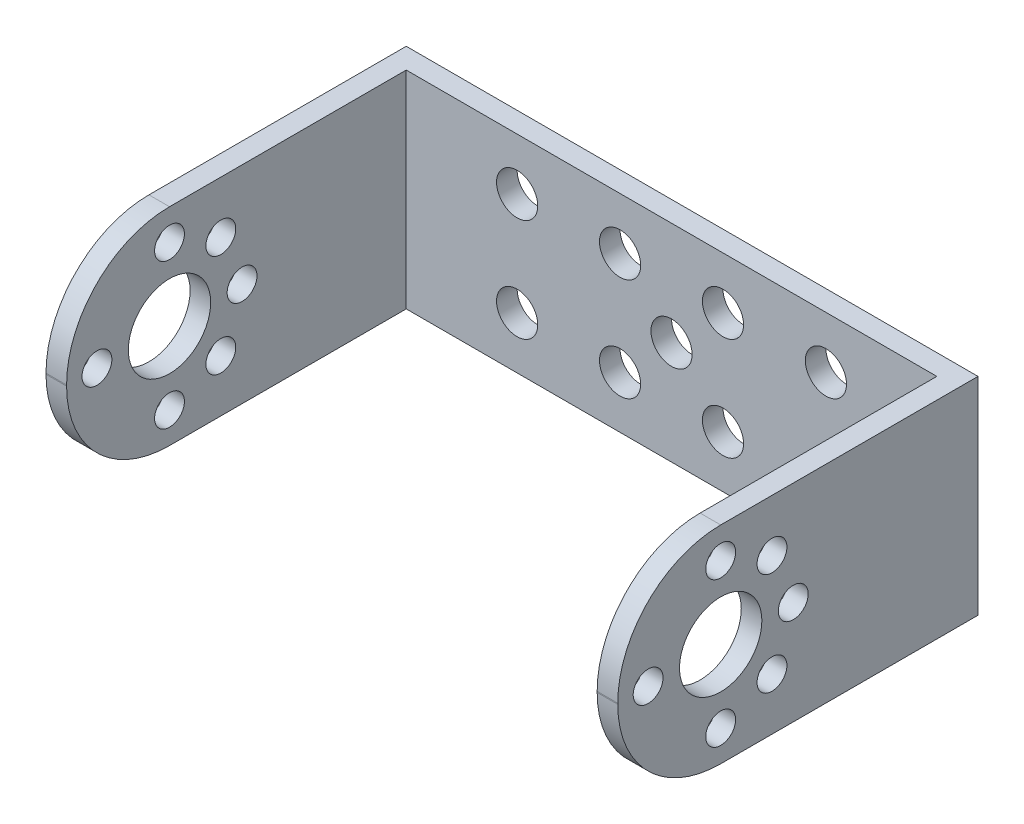
ISO-10303-21;
HEADER;
FILE_DESCRIPTION(('STEP AP214'),'2;1');
FILE_NAME('part.step','',(''),(''),'','','');
FILE_SCHEMA(('AUTOMOTIVE_DESIGN { 1 0 10303 214 1 1 1 1 }'));
ENDSEC;
DATA;
#1=APPLICATION_CONTEXT('core data for automotive mechanical design processes');
#2=APPLICATION_PROTOCOL_DEFINITION('international standard','automotive_design',2000,#1);
#3=PRODUCT_CONTEXT('',#1,'mechanical');
#4=PRODUCT('Part','Part','',(#3));
#5=PRODUCT_RELATED_PRODUCT_CATEGORY('part','',(#4));
#6=PRODUCT_DEFINITION_FORMATION('','',#4);
#7=PRODUCT_DEFINITION_CONTEXT('part definition',#1,'design');
#8=PRODUCT_DEFINITION('design','',#6,#7);
#9=PRODUCT_DEFINITION_SHAPE('','',#8);
#10=(LENGTH_UNIT() NAMED_UNIT(*) SI_UNIT(.MILLI.,.METRE.));
#11=(NAMED_UNIT(*) PLANE_ANGLE_UNIT() SI_UNIT($,.RADIAN.));
#12=(NAMED_UNIT(*) SI_UNIT($,.STERADIAN.) SOLID_ANGLE_UNIT());
#13=UNCERTAINTY_MEASURE_WITH_UNIT(LENGTH_MEASURE(1.E-05),#10,'distance_accuracy_value','');
#14=(GEOMETRIC_REPRESENTATION_CONTEXT(3) GLOBAL_UNCERTAINTY_ASSIGNED_CONTEXT((#13)) GLOBAL_UNIT_ASSIGNED_CONTEXT((#10,
#11,#12)) REPRESENTATION_CONTEXT('',''));
#15=CARTESIAN_POINT('',(0.,0.,0.));
#16=DIRECTION('',(0.,0.,1.));
#17=DIRECTION('',(1.,0.,0.));
#18=AXIS2_PLACEMENT_3D('',#15,#16,#17);
#19=CARTESIAN_POINT('',(0.,0.,2.));
#20=DIRECTION('',(0.,0.,-1.));
#21=DIRECTION('',(-1.,0.,0.));
#22=AXIS2_PLACEMENT_3D('',#19,#20,#21);
#23=PLANE('',#22);
#24=CARTESIAN_POINT('',(4.99999999999999,5.00000000000001,2.));
#25=DIRECTION('',(0.,0.,1.));
#26=DIRECTION('',(1.,0.,0.));
#27=AXIS2_PLACEMENT_3D('',#24,#25,#26);
#28=CIRCLE('',#27,2.);
#29=CARTESIAN_POINT('',(6.99999999999999,5.00000000000001,2.));
#30=VERTEX_POINT('',#29);
#31=EDGE_CURVE('E285',#30,#30,#28,.T.);
#32=ORIENTED_EDGE('',*,*,#31,.F.);
#33=EDGE_LOOP('',(#32));
#34=FACE_BOUND('',#33,.T.);
#35=CARTESIAN_POINT('',(4.99999999999999,-4.99999999999999,2.));
#36=DIRECTION('',(0.,0.,1.));
#37=DIRECTION('',(1.,0.,0.));
#38=AXIS2_PLACEMENT_3D('',#35,#36,#37);
#39=CIRCLE('',#38,2.);
#40=CARTESIAN_POINT('',(6.99999999999999,-4.99999999999999,2.));
#41=VERTEX_POINT('',#40);
#42=EDGE_CURVE('E291',#41,#41,#39,.T.);
#43=ORIENTED_EDGE('',*,*,#42,.F.);
#44=EDGE_LOOP('',(#43));
#45=FACE_BOUND('',#44,.T.);
#46=CARTESIAN_POINT('',(-4.99999999999999,-4.99999999999999,2.));
#47=DIRECTION('',(0.,0.,1.));
#48=DIRECTION('',(-1.,0.,0.));
#49=AXIS2_PLACEMENT_3D('',#46,#47,#48);
#50=CIRCLE('',#49,2.);
#51=CARTESIAN_POINT('',(-6.99999999999999,-4.99999999999999,2.));
#52=VERTEX_POINT('',#51);
#53=EDGE_CURVE('E297',#52,#52,#50,.T.);
#54=ORIENTED_EDGE('',*,*,#53,.F.);
#55=EDGE_LOOP('',(#54));
#56=FACE_BOUND('',#55,.T.);
#57=CARTESIAN_POINT('',(-4.99999999999999,5.00000000000001,2.));
#58=DIRECTION('',(0.,0.,1.));
#59=DIRECTION('',(-1.,0.,0.));
#60=AXIS2_PLACEMENT_3D('',#57,#58,#59);
#61=CIRCLE('',#60,2.);
#62=CARTESIAN_POINT('',(-6.99999999999999,5.00000000000001,2.));
#63=VERTEX_POINT('',#62);
#64=EDGE_CURVE('E261',#63,#63,#61,.T.);
#65=ORIENTED_EDGE('',*,*,#64,.F.);
#66=EDGE_LOOP('',(#65));
#67=FACE_BOUND('',#66,.T.);
#68=CARTESIAN_POINT('',(15.,5.00000000000001,2.));
#69=DIRECTION('',(0.,0.,1.));
#70=DIRECTION('',(1.,0.,0.));
#71=AXIS2_PLACEMENT_3D('',#68,#69,#70);
#72=CIRCLE('',#71,2.);
#73=CARTESIAN_POINT('',(17.,5.00000000000001,2.));
#74=VERTEX_POINT('',#73);
#75=EDGE_CURVE('E262',#74,#74,#72,.T.);
#76=ORIENTED_EDGE('',*,*,#75,.F.);
#77=EDGE_LOOP('',(#76));
#78=FACE_BOUND('',#77,.T.);
#79=CARTESIAN_POINT('',(15.,-4.99999999999999,2.));
#80=DIRECTION('',(0.,0.,1.));
#81=DIRECTION('',(1.,0.,0.));
#82=AXIS2_PLACEMENT_3D('',#79,#80,#81);
#83=CIRCLE('',#82,2.);
#84=CARTESIAN_POINT('',(17.,-4.99999999999999,2.));
#85=VERTEX_POINT('',#84);
#86=EDGE_CURVE('E268',#85,#85,#83,.T.);
#87=ORIENTED_EDGE('',*,*,#86,.F.);
#88=EDGE_LOOP('',(#87));
#89=FACE_BOUND('',#88,.T.);
#90=CARTESIAN_POINT('',(-15.,5.,2.));
#91=DIRECTION('',(0.,0.,1.));
#92=DIRECTION('',(-1.,0.,0.));
#93=AXIS2_PLACEMENT_3D('',#90,#91,#92);
#94=CIRCLE('',#93,2.);
#95=CARTESIAN_POINT('',(-17.,5.,2.));
#96=VERTEX_POINT('',#95);
#97=EDGE_CURVE('E274',#96,#96,#94,.T.);
#98=ORIENTED_EDGE('',*,*,#97,.F.);
#99=EDGE_LOOP('',(#98));
#100=FACE_BOUND('',#99,.T.);
#101=CARTESIAN_POINT('',(-15.,-5.,2.));
#102=DIRECTION('',(0.,0.,1.));
#103=DIRECTION('',(-1.,0.,0.));
#104=AXIS2_PLACEMENT_3D('',#101,#102,#103);
#105=CIRCLE('',#104,2.);
#106=CARTESIAN_POINT('',(-17.,-5.,2.));
#107=VERTEX_POINT('',#106);
#108=EDGE_CURVE('E257',#107,#107,#105,.T.);
#109=ORIENTED_EDGE('',*,*,#108,.F.);
#110=EDGE_LOOP('',(#109));
#111=FACE_BOUND('',#110,.T.);
#112=CARTESIAN_POINT('',(0.,0.,2.));
#113=DIRECTION('',(0.,0.,1.));
#114=DIRECTION('',(1.,0.,0.));
#115=AXIS2_PLACEMENT_3D('',#112,#113,#114);
#116=CIRCLE('',#115,2.);
#117=CARTESIAN_POINT('',(2.,0.,2.));
#118=VERTEX_POINT('',#117);
#119=EDGE_CURVE('E153',#118,#118,#116,.T.);
#120=ORIENTED_EDGE('',*,*,#119,.F.);
#121=EDGE_LOOP('',(#120));
#122=FACE_BOUND('',#121,.T.);
#123=DIRECTION('',(0.,-1.,0.));
#124=VECTOR('',#123,1.);
#125=CARTESIAN_POINT('',(25.775,0.,2.));
#126=LINE('',#125,#124);
#127=CARTESIAN_POINT('',(25.775,10.05,2.));
#128=VERTEX_POINT('',#127);
#129=CARTESIAN_POINT('',(25.775,-10.05,2.));
#130=VERTEX_POINT('',#129);
#131=EDGE_CURVE('E247',#128,#130,#126,.T.);
#132=ORIENTED_EDGE('',*,*,#131,.F.);
#133=DIRECTION('',(-1.,0.,0.));
#134=VECTOR('',#133,1.);
#135=CARTESIAN_POINT('',(-27.775,10.05,2.));
#136=LINE('',#135,#134);
#137=CARTESIAN_POINT('',(-25.775,10.05,2.));
#138=VERTEX_POINT('',#137);
#139=EDGE_CURVE('E162',#128,#138,#136,.T.);
#140=ORIENTED_EDGE('',*,*,#139,.T.);
#141=DIRECTION('',(0.,1.,0.));
#142=VECTOR('',#141,1.);
#143=CARTESIAN_POINT('',(-25.775,0.,2.));
#144=LINE('',#143,#142);
#145=CARTESIAN_POINT('',(-25.775,-10.05,2.));
#146=VERTEX_POINT('',#145);
#147=EDGE_CURVE('E235',#146,#138,#144,.T.);
#148=ORIENTED_EDGE('',*,*,#147,.F.);
#149=DIRECTION('',(1.,0.,0.));
#150=VECTOR('',#149,1.);
#151=CARTESIAN_POINT('',(-27.775,-10.05,2.));
#152=LINE('',#151,#150);
#153=EDGE_CURVE('E156',#146,#130,#152,.T.);
#154=ORIENTED_EDGE('',*,*,#153,.T.);
#155=EDGE_LOOP('',(#132,#140,#148,#154));
#156=FACE_BOUND('',#155,.T.);
#157=ADVANCED_FACE('F33',(#34,#45,#56,#67,#78,#89,#100,#111,#122,#156),#23,.F.);
#158=CARTESIAN_POINT('',(27.775,-10.05,2.));
#159=DIRECTION('',(-1.,0.,0.));
#160=DIRECTION('',(0.,0.,1.));
#161=AXIS2_PLACEMENT_3D('',#158,#159,#160);
#162=PLANE('',#161);
#163=CARTESIAN_POINT('',(27.775,4.9851028073651,20.0148971926348));
#164=DIRECTION('',(1.,0.,0.));
#165=DIRECTION('',(0.,0.,-1.));
#166=AXIS2_PLACEMENT_3D('',#163,#164,#165);
#167=CIRCLE('',#166,1.45);
#168=CARTESIAN_POINT('',(27.775,4.9851028073651,18.5648971926348));
#169=VERTEX_POINT('',#168);
#170=EDGE_CURVE('E348',#169,#169,#167,.T.);
#171=ORIENTED_EDGE('',*,*,#170,.F.);
#172=EDGE_LOOP('',(#171));
#173=FACE_BOUND('',#172,.T.);
#174=CARTESIAN_POINT('',(27.775,7.05,25.));
#175=DIRECTION('',(1.,0.,0.));
#176=DIRECTION('',(0.,0.,-1.));
#177=AXIS2_PLACEMENT_3D('',#174,#175,#176);
#178=CIRCLE('',#177,1.45);
#179=CARTESIAN_POINT('',(27.775,7.05,23.55));
#180=VERTEX_POINT('',#179);
#181=EDGE_CURVE('E347',#180,#180,#178,.T.);
#182=ORIENTED_EDGE('',*,*,#181,.F.);
#183=EDGE_LOOP('',(#182));
#184=FACE_BOUND('',#183,.T.);
#185=CARTESIAN_POINT('',(27.775,-7.05,25.));
#186=DIRECTION('',(1.,0.,0.));
#187=DIRECTION('',(0.,0.,1.));
#188=AXIS2_PLACEMENT_3D('',#185,#186,#187);
#189=CIRCLE('',#188,1.45);
#190=CARTESIAN_POINT('',(27.775,-7.05,26.45));
#191=VERTEX_POINT('',#190);
#192=EDGE_CURVE('E354',#191,#191,#189,.T.);
#193=ORIENTED_EDGE('',*,*,#192,.F.);
#194=EDGE_LOOP('',(#193));
#195=FACE_BOUND('',#194,.T.);
#196=CARTESIAN_POINT('',(27.775,-4.9851028073651,20.0148971926348));
#197=DIRECTION('',(1.,0.,0.));
#198=DIRECTION('',(0.,0.,1.));
#199=AXIS2_PLACEMENT_3D('',#196,#197,#198);
#200=CIRCLE('',#199,1.45);
#201=CARTESIAN_POINT('',(27.775,-4.9851028073651,21.4648971926348));
#202=VERTEX_POINT('',#201);
#203=EDGE_CURVE('E360',#202,#202,#200,.T.);
#204=ORIENTED_EDGE('',*,*,#203,.F.);
#205=EDGE_LOOP('',(#204));
#206=FACE_BOUND('',#205,.T.);
#207=CARTESIAN_POINT('',(27.775,0.,17.95));
#208=DIRECTION('',(1.,0.,0.));
#209=DIRECTION('',(0.,0.,1.));
#210=AXIS2_PLACEMENT_3D('',#207,#208,#209);
#211=CIRCLE('',#210,1.45);
#212=CARTESIAN_POINT('',(27.775,0.,19.4));
#213=VERTEX_POINT('',#212);
#214=EDGE_CURVE('E366',#213,#213,#211,.T.);
#215=ORIENTED_EDGE('',*,*,#214,.F.);
#216=EDGE_LOOP('',(#215));
#217=FACE_BOUND('',#216,.T.);
#218=CARTESIAN_POINT('',(27.775,0.,32.05));
#219=DIRECTION('',(1.,0.,0.));
#220=DIRECTION('',(0.,0.,-1.));
#221=AXIS2_PLACEMENT_3D('',#218,#219,#220);
#222=CIRCLE('',#221,1.45);
#223=CARTESIAN_POINT('',(27.775,0.,30.6));
#224=VERTEX_POINT('',#223);
#225=EDGE_CURVE('E372',#224,#224,#222,.T.);
#226=ORIENTED_EDGE('',*,*,#225,.F.);
#227=EDGE_LOOP('',(#226));
#228=FACE_BOUND('',#227,.T.);
#229=CARTESIAN_POINT('',(27.775,0.,25.));
#230=DIRECTION('',(1.,0.,0.));
#231=DIRECTION('',(0.,0.,-1.));
#232=AXIS2_PLACEMENT_3D('',#229,#230,#231);
#233=CIRCLE('',#232,4.);
#234=CARTESIAN_POINT('',(27.775,0.,21.));
#235=VERTEX_POINT('',#234);
#236=EDGE_CURVE('E340',#235,#235,#233,.T.);
#237=ORIENTED_EDGE('',*,*,#236,.F.);
#238=EDGE_LOOP('',(#237));
#239=FACE_BOUND('',#238,.T.);
#240=DIRECTION('',(0.,0.,-1.));
#241=VECTOR('',#240,1.);
#242=CARTESIAN_POINT('',(27.775,10.05,2.));
#243=LINE('',#242,#241);
#244=CARTESIAN_POINT('',(27.775,10.05,25.));
#245=VERTEX_POINT('',#244);
#246=CARTESIAN_POINT('',(27.775,10.05,0.));
#247=VERTEX_POINT('',#246);
#248=EDGE_CURVE('E122',#245,#247,#243,.T.);
#249=ORIENTED_EDGE('',*,*,#248,.F.);
#250=CARTESIAN_POINT('',(27.775,0.049999999999998,25.));
#251=DIRECTION('',(-1.,0.,0.));
#252=DIRECTION('',(0.,0.,1.));
#253=AXIS2_PLACEMENT_3D('',#250,#251,#252);
#254=CIRCLE('',#253,10.);
#255=CARTESIAN_POINT('',(27.775,0.049999999999998,35.));
#256=VERTEX_POINT('',#255);
#257=EDGE_CURVE('E210',#245,#256,#254,.F.);
#258=ORIENTED_EDGE('',*,*,#257,.T.);
#259=DIRECTION('',(0.,1.,0.));
#260=VECTOR('',#259,1.);
#261=CARTESIAN_POINT('',(27.775,10.05,35.));
#262=LINE('',#261,#260);
#263=CARTESIAN_POINT('',(27.775,-0.0500000000000014,35.));
#264=VERTEX_POINT('',#263);
#265=EDGE_CURVE('E321',#264,#256,#262,.T.);
#266=ORIENTED_EDGE('',*,*,#265,.F.);
#267=CARTESIAN_POINT('',(27.775,-0.0500000000000014,25.));
#268=DIRECTION('',(-1.,0.,0.));
#269=DIRECTION('',(0.,0.,1.));
#270=AXIS2_PLACEMENT_3D('',#267,#268,#269);
#271=CIRCLE('',#270,10.);
#272=CARTESIAN_POINT('',(27.775,-10.05,25.));
#273=VERTEX_POINT('',#272);
#274=EDGE_CURVE('E208',#264,#273,#271,.F.);
#275=ORIENTED_EDGE('',*,*,#274,.T.);
#276=DIRECTION('',(0.,0.,-1.));
#277=VECTOR('',#276,1.);
#278=CARTESIAN_POINT('',(27.775,-10.05,2.));
#279=LINE('',#278,#277);
#280=CARTESIAN_POINT('',(27.775,-10.05,0.));
#281=VERTEX_POINT('',#280);
#282=EDGE_CURVE('E148',#273,#281,#279,.T.);
#283=ORIENTED_EDGE('',*,*,#282,.T.);
#284=DIRECTION('',(0.,1.,0.));
#285=VECTOR('',#284,1.);
#286=CARTESIAN_POINT('',(27.775,-10.05,0.));
#287=LINE('',#286,#285);
#288=EDGE_CURVE('E142',#281,#247,#287,.T.);
#289=ORIENTED_EDGE('',*,*,#288,.T.);
#290=EDGE_LOOP('',(#249,#258,#266,#275,#283,#289));
#291=FACE_BOUND('',#290,.T.);
#292=ADVANCED_FACE('F146',(#173,#184,#195,#206,#217,#228,#239,#291),#162,.F.);
#293=CARTESIAN_POINT('',(-27.775,10.05,2.));
#294=DIRECTION('',(0.,-1.,0.));
#295=DIRECTION('',(0.,0.,-1.));
#296=AXIS2_PLACEMENT_3D('',#293,#294,#295);
#297=PLANE('',#296);
#298=DIRECTION('',(0.,0.,-1.));
#299=VECTOR('',#298,1.);
#300=CARTESIAN_POINT('',(25.775,10.05,35.));
#301=LINE('',#300,#299);
#302=CARTESIAN_POINT('',(25.775,10.05,25.));
#303=VERTEX_POINT('',#302);
#304=EDGE_CURVE('E251',#303,#128,#301,.T.);
#305=ORIENTED_EDGE('',*,*,#304,.F.);
#306=DIRECTION('',(-1.,0.,0.));
#307=VECTOR('',#306,1.);
#308=CARTESIAN_POINT('',(-27.775,10.05,25.));
#309=LINE('',#308,#307);
#310=EDGE_CURVE('E130',#303,#245,#309,.F.);
#311=ORIENTED_EDGE('',*,*,#310,.T.);
#312=ORIENTED_EDGE('',*,*,#248,.T.);
#313=DIRECTION('',(-1.,0.,0.));
#314=VECTOR('',#313,1.);
#315=CARTESIAN_POINT('',(-27.775,10.05,0.));
#316=LINE('',#315,#314);
#317=CARTESIAN_POINT('',(-27.775,10.05,0.));
#318=VERTEX_POINT('',#317);
#319=EDGE_CURVE('E127',#247,#318,#316,.T.);
#320=ORIENTED_EDGE('',*,*,#319,.T.);
#321=DIRECTION('',(0.,0.,-1.));
#322=VECTOR('',#321,1.);
#323=CARTESIAN_POINT('',(-27.775,10.05,2.));
#324=LINE('',#323,#322);
#325=CARTESIAN_POINT('',(-27.775,10.05,25.));
#326=VERTEX_POINT('',#325);
#327=EDGE_CURVE('E135',#326,#318,#324,.T.);
#328=ORIENTED_EDGE('',*,*,#327,.F.);
#329=DIRECTION('',(-1.,0.,0.));
#330=VECTOR('',#329,1.);
#331=CARTESIAN_POINT('',(-25.775,10.05,25.));
#332=LINE('',#331,#330);
#333=CARTESIAN_POINT('',(-25.775,10.05,25.));
#334=VERTEX_POINT('',#333);
#335=EDGE_CURVE('E205',#326,#334,#332,.F.);
#336=ORIENTED_EDGE('',*,*,#335,.T.);
#337=DIRECTION('',(0.,0.,-1.));
#338=VECTOR('',#337,1.);
#339=CARTESIAN_POINT('',(-25.775,10.05,35.));
#340=LINE('',#339,#338);
#341=EDGE_CURVE('E236',#334,#138,#340,.T.);
#342=ORIENTED_EDGE('',*,*,#341,.T.);
#343=ORIENTED_EDGE('',*,*,#139,.F.);
#344=EDGE_LOOP('',(#305,#311,#312,#320,#328,#336,#342,#343));
#345=FACE_BOUND('',#344,.T.);
#346=ADVANCED_FACE('F125',(#345),#297,.F.);
#347=CARTESIAN_POINT('',(-27.775,-10.05,2.));
#348=DIRECTION('',(1.,0.,0.));
#349=DIRECTION('',(0.,0.,-1.));
#350=AXIS2_PLACEMENT_3D('',#347,#348,#349);
#351=PLANE('',#350);
#352=CARTESIAN_POINT('',(-27.775,4.9851028073651,20.0148971926348));
#353=DIRECTION('',(1.,0.,0.));
#354=DIRECTION('',(0.,0.,-1.));
#355=AXIS2_PLACEMENT_3D('',#352,#353,#354);
#356=CIRCLE('',#355,1.45);
#357=CARTESIAN_POINT('',(-27.775,4.9851028073651,18.5648971926348));
#358=VERTEX_POINT('',#357);
#359=EDGE_CURVE('E344',#358,#358,#356,.F.);
#360=ORIENTED_EDGE('',*,*,#359,.F.);
#361=EDGE_LOOP('',(#360));
#362=FACE_BOUND('',#361,.T.);
#363=CARTESIAN_POINT('',(-27.775,7.05,25.));
#364=DIRECTION('',(1.,0.,0.));
#365=DIRECTION('',(0.,0.,-1.));
#366=AXIS2_PLACEMENT_3D('',#363,#364,#365);
#367=CIRCLE('',#366,1.45);
#368=CARTESIAN_POINT('',(-27.775,7.05,23.55));
#369=VERTEX_POINT('',#368);
#370=EDGE_CURVE('E351',#369,#369,#367,.F.);
#371=ORIENTED_EDGE('',*,*,#370,.F.);
#372=EDGE_LOOP('',(#371));
#373=FACE_BOUND('',#372,.T.);
#374=CARTESIAN_POINT('',(-27.775,-7.05,25.));
#375=DIRECTION('',(1.,0.,0.));
#376=DIRECTION('',(0.,0.,-1.));
#377=AXIS2_PLACEMENT_3D('',#374,#375,#376);
#378=CIRCLE('',#377,1.45);
#379=CARTESIAN_POINT('',(-27.775,-7.05,23.55));
#380=VERTEX_POINT('',#379);
#381=EDGE_CURVE('E357',#380,#380,#378,.F.);
#382=ORIENTED_EDGE('',*,*,#381,.F.);
#383=EDGE_LOOP('',(#382));
#384=FACE_BOUND('',#383,.T.);
#385=CARTESIAN_POINT('',(-27.775,-4.9851028073651,20.0148971926348));
#386=DIRECTION('',(1.,0.,0.));
#387=DIRECTION('',(0.,0.,-1.));
#388=AXIS2_PLACEMENT_3D('',#385,#386,#387);
#389=CIRCLE('',#388,1.45);
#390=CARTESIAN_POINT('',(-27.775,-4.9851028073651,18.5648971926348));
#391=VERTEX_POINT('',#390);
#392=EDGE_CURVE('E363',#391,#391,#389,.F.);
#393=ORIENTED_EDGE('',*,*,#392,.F.);
#394=EDGE_LOOP('',(#393));
#395=FACE_BOUND('',#394,.T.);
#396=CARTESIAN_POINT('',(-27.775,0.,17.95));
#397=DIRECTION('',(1.,0.,0.));
#398=DIRECTION('',(0.,0.,-1.));
#399=AXIS2_PLACEMENT_3D('',#396,#397,#398);
#400=CIRCLE('',#399,1.45);
#401=CARTESIAN_POINT('',(-27.775,0.,16.5));
#402=VERTEX_POINT('',#401);
#403=EDGE_CURVE('E369',#402,#402,#400,.F.);
#404=ORIENTED_EDGE('',*,*,#403,.F.);
#405=EDGE_LOOP('',(#404));
#406=FACE_BOUND('',#405,.T.);
#407=CARTESIAN_POINT('',(-27.775,0.,32.05));
#408=DIRECTION('',(1.,0.,0.));
#409=DIRECTION('',(0.,0.,-1.));
#410=AXIS2_PLACEMENT_3D('',#407,#408,#409);
#411=CIRCLE('',#410,1.45);
#412=CARTESIAN_POINT('',(-27.775,0.,30.6));
#413=VERTEX_POINT('',#412);
#414=EDGE_CURVE('E343',#413,#413,#411,.F.);
#415=ORIENTED_EDGE('',*,*,#414,.F.);
#416=EDGE_LOOP('',(#415));
#417=FACE_BOUND('',#416,.T.);
#418=CARTESIAN_POINT('',(-27.775,0.,25.));
#419=DIRECTION('',(1.,0.,0.));
#420=DIRECTION('',(0.,0.,-1.));
#421=AXIS2_PLACEMENT_3D('',#418,#419,#420);
#422=CIRCLE('',#421,4.);
#423=CARTESIAN_POINT('',(-27.775,0.,21.));
#424=VERTEX_POINT('',#423);
#425=EDGE_CURVE('E171',#424,#424,#422,.F.);
#426=ORIENTED_EDGE('',*,*,#425,.F.);
#427=EDGE_LOOP('',(#426));
#428=FACE_BOUND('',#427,.T.);
#429=DIRECTION('',(0.,-1.,0.));
#430=VECTOR('',#429,1.);
#431=CARTESIAN_POINT('',(-27.775,10.05,35.));
#432=LINE('',#431,#430);
#433=CARTESIAN_POINT('',(-27.775,0.049999999999998,35.));
#434=VERTEX_POINT('',#433);
#435=CARTESIAN_POINT('',(-27.775,-0.0500000000000014,35.));
#436=VERTEX_POINT('',#435);
#437=EDGE_CURVE('E243',#434,#436,#432,.T.);
#438=ORIENTED_EDGE('',*,*,#437,.F.);
#439=CARTESIAN_POINT('',(-27.775,0.049999999999998,25.));
#440=DIRECTION('',(1.,0.,0.));
#441=DIRECTION('',(0.,0.,-1.));
#442=AXIS2_PLACEMENT_3D('',#439,#440,#441);
#443=CIRCLE('',#442,10.);
#444=EDGE_CURVE('E223',#434,#326,#443,.F.);
#445=ORIENTED_EDGE('',*,*,#444,.T.);
#446=ORIENTED_EDGE('',*,*,#327,.T.);
#447=DIRECTION('',(0.,-1.,0.));
#448=VECTOR('',#447,1.);
#449=CARTESIAN_POINT('',(-27.775,-10.05,0.));
#450=LINE('',#449,#448);
#451=CARTESIAN_POINT('',(-27.775,-10.05,0.));
#452=VERTEX_POINT('',#451);
#453=EDGE_CURVE('E144',#318,#452,#450,.T.);
#454=ORIENTED_EDGE('',*,*,#453,.T.);
#455=DIRECTION('',(0.,0.,-1.));
#456=VECTOR('',#455,1.);
#457=CARTESIAN_POINT('',(-27.775,-10.05,2.));
#458=LINE('',#457,#456);
#459=CARTESIAN_POINT('',(-27.775,-10.05,25.));
#460=VERTEX_POINT('',#459);
#461=EDGE_CURVE('E164',#460,#452,#458,.T.);
#462=ORIENTED_EDGE('',*,*,#461,.F.);
#463=CARTESIAN_POINT('',(-27.775,-0.0500000000000014,25.));
#464=DIRECTION('',(1.,0.,0.));
#465=DIRECTION('',(0.,0.,-1.));
#466=AXIS2_PLACEMENT_3D('',#463,#464,#465);
#467=CIRCLE('',#466,10.);
#468=EDGE_CURVE('E221',#460,#436,#467,.F.);
#469=ORIENTED_EDGE('',*,*,#468,.T.);
#470=EDGE_LOOP('',(#438,#445,#446,#454,#462,#469));
#471=FACE_BOUND('',#470,.T.);
#472=ADVANCED_FACE('F242',(#362,#373,#384,#395,#406,#417,#428,#471),#351,.F.);
#473=CARTESIAN_POINT('',(-27.775,-10.05,2.));
#474=DIRECTION('',(0.,1.,0.));
#475=DIRECTION('',(0.,0.,1.));
#476=AXIS2_PLACEMENT_3D('',#473,#474,#475);
#477=PLANE('',#476);
#478=ORIENTED_EDGE('',*,*,#282,.F.);
#479=DIRECTION('',(1.,0.,0.));
#480=VECTOR('',#479,1.);
#481=CARTESIAN_POINT('',(-27.775,-10.05,25.));
#482=LINE('',#481,#480);
#483=CARTESIAN_POINT('',(25.775,-10.05,25.));
#484=VERTEX_POINT('',#483);
#485=EDGE_CURVE('E214',#273,#484,#482,.F.);
#486=ORIENTED_EDGE('',*,*,#485,.T.);
#487=DIRECTION('',(0.,0.,-1.));
#488=VECTOR('',#487,1.);
#489=CARTESIAN_POINT('',(25.775,-10.05,35.));
#490=LINE('',#489,#488);
#491=EDGE_CURVE('E314',#484,#130,#490,.T.);
#492=ORIENTED_EDGE('',*,*,#491,.T.);
#493=ORIENTED_EDGE('',*,*,#153,.F.);
#494=DIRECTION('',(0.,0.,-1.));
#495=VECTOR('',#494,1.);
#496=CARTESIAN_POINT('',(-25.775,-10.05,35.));
#497=LINE('',#496,#495);
#498=CARTESIAN_POINT('',(-25.775,-10.05,25.));
#499=VERTEX_POINT('',#498);
#500=EDGE_CURVE('E227',#499,#146,#497,.T.);
#501=ORIENTED_EDGE('',*,*,#500,.F.);
#502=DIRECTION('',(1.,0.,0.));
#503=VECTOR('',#502,1.);
#504=CARTESIAN_POINT('',(-27.775,-10.05,25.));
#505=LINE('',#504,#503);
#506=EDGE_CURVE('E212',#499,#460,#505,.F.);
#507=ORIENTED_EDGE('',*,*,#506,.T.);
#508=ORIENTED_EDGE('',*,*,#461,.T.);
#509=DIRECTION('',(1.,0.,0.));
#510=VECTOR('',#509,1.);
#511=CARTESIAN_POINT('',(-27.775,-10.05,0.));
#512=LINE('',#511,#510);
#513=EDGE_CURVE('E160',#452,#281,#512,.T.);
#514=ORIENTED_EDGE('',*,*,#513,.T.);
#515=EDGE_LOOP('',(#478,#486,#492,#493,#501,#507,#508,#514));
#516=FACE_BOUND('',#515,.T.);
#517=ADVANCED_FACE('F232',(#516),#477,.F.);
#518=CARTESIAN_POINT('',(0.,0.,0.));
#519=DIRECTION('',(0.,0.,-1.));
#520=DIRECTION('',(-1.,0.,0.));
#521=AXIS2_PLACEMENT_3D('',#518,#519,#520);
#522=PLANE('',#521);
#523=ORIENTED_EDGE('',*,*,#288,.F.);
#524=ORIENTED_EDGE('',*,*,#513,.F.);
#525=ORIENTED_EDGE('',*,*,#453,.F.);
#526=ORIENTED_EDGE('',*,*,#319,.F.);
#527=EDGE_LOOP('',(#523,#524,#525,#526));
#528=FACE_BOUND('',#527,.T.);
#529=CARTESIAN_POINT('',(4.99999999999999,5.00000000000001,0.));
#530=DIRECTION('',(0.,0.,1.));
#531=DIRECTION('',(1.,0.,0.));
#532=AXIS2_PLACEMENT_3D('',#529,#530,#531);
#533=CIRCLE('',#532,2.);
#534=CARTESIAN_POINT('',(6.99999999999999,5.00000000000001,0.));
#535=VERTEX_POINT('',#534);
#536=EDGE_CURVE('E282',#535,#535,#533,.T.);
#537=ORIENTED_EDGE('',*,*,#536,.T.);
#538=EDGE_LOOP('',(#537));
#539=FACE_BOUND('',#538,.T.);
#540=CARTESIAN_POINT('',(4.99999999999999,-4.99999999999999,0.));
#541=DIRECTION('',(0.,0.,1.));
#542=DIRECTION('',(1.,0.,0.));
#543=AXIS2_PLACEMENT_3D('',#540,#541,#542);
#544=CIRCLE('',#543,2.);
#545=CARTESIAN_POINT('',(6.99999999999999,-4.99999999999999,0.));
#546=VERTEX_POINT('',#545);
#547=EDGE_CURVE('E288',#546,#546,#544,.T.);
#548=ORIENTED_EDGE('',*,*,#547,.T.);
#549=EDGE_LOOP('',(#548));
#550=FACE_BOUND('',#549,.T.);
#551=CARTESIAN_POINT('',(-4.99999999999999,-4.99999999999999,0.));
#552=DIRECTION('',(0.,0.,1.));
#553=DIRECTION('',(-1.,0.,0.));
#554=AXIS2_PLACEMENT_3D('',#551,#552,#553);
#555=CIRCLE('',#554,2.);
#556=CARTESIAN_POINT('',(-6.99999999999999,-4.99999999999999,0.));
#557=VERTEX_POINT('',#556);
#558=EDGE_CURVE('E294',#557,#557,#555,.T.);
#559=ORIENTED_EDGE('',*,*,#558,.T.);
#560=EDGE_LOOP('',(#559));
#561=FACE_BOUND('',#560,.T.);
#562=CARTESIAN_POINT('',(-4.99999999999999,5.00000000000001,0.));
#563=DIRECTION('',(0.,0.,1.));
#564=DIRECTION('',(-1.,0.,0.));
#565=AXIS2_PLACEMENT_3D('',#562,#563,#564);
#566=CIRCLE('',#565,2.);
#567=CARTESIAN_POINT('',(-6.99999999999999,5.00000000000001,0.));
#568=VERTEX_POINT('',#567);
#569=EDGE_CURVE('E300',#568,#568,#566,.T.);
#570=ORIENTED_EDGE('',*,*,#569,.T.);
#571=EDGE_LOOP('',(#570));
#572=FACE_BOUND('',#571,.T.);
#573=CARTESIAN_POINT('',(15.,5.00000000000001,0.));
#574=DIRECTION('',(0.,0.,1.));
#575=DIRECTION('',(1.,0.,0.));
#576=AXIS2_PLACEMENT_3D('',#573,#574,#575);
#577=CIRCLE('',#576,2.);
#578=CARTESIAN_POINT('',(17.,5.00000000000001,0.));
#579=VERTEX_POINT('',#578);
#580=EDGE_CURVE('E258',#579,#579,#577,.T.);
#581=ORIENTED_EDGE('',*,*,#580,.T.);
#582=EDGE_LOOP('',(#581));
#583=FACE_BOUND('',#582,.T.);
#584=CARTESIAN_POINT('',(15.,-4.99999999999999,0.));
#585=DIRECTION('',(0.,0.,1.));
#586=DIRECTION('',(1.,0.,0.));
#587=AXIS2_PLACEMENT_3D('',#584,#585,#586);
#588=CIRCLE('',#587,2.);
#589=CARTESIAN_POINT('',(17.,-4.99999999999999,0.));
#590=VERTEX_POINT('',#589);
#591=EDGE_CURVE('E265',#590,#590,#588,.T.);
#592=ORIENTED_EDGE('',*,*,#591,.T.);
#593=EDGE_LOOP('',(#592));
#594=FACE_BOUND('',#593,.T.);
#595=CARTESIAN_POINT('',(-15.,5.,0.));
#596=DIRECTION('',(0.,0.,1.));
#597=DIRECTION('',(-1.,0.,0.));
#598=AXIS2_PLACEMENT_3D('',#595,#596,#597);
#599=CIRCLE('',#598,2.);
#600=CARTESIAN_POINT('',(-17.,5.,0.));
#601=VERTEX_POINT('',#600);
#602=EDGE_CURVE('E271',#601,#601,#599,.T.);
#603=ORIENTED_EDGE('',*,*,#602,.T.);
#604=EDGE_LOOP('',(#603));
#605=FACE_BOUND('',#604,.T.);
#606=CARTESIAN_POINT('',(-15.,-5.,0.));
#607=DIRECTION('',(0.,0.,1.));
#608=DIRECTION('',(-1.,0.,0.));
#609=AXIS2_PLACEMENT_3D('',#606,#607,#608);
#610=CIRCLE('',#609,2.);
#611=CARTESIAN_POINT('',(-17.,-5.,0.));
#612=VERTEX_POINT('',#611);
#613=EDGE_CURVE('E277',#612,#612,#610,.T.);
#614=ORIENTED_EDGE('',*,*,#613,.T.);
#615=EDGE_LOOP('',(#614));
#616=FACE_BOUND('',#615,.T.);
#617=CARTESIAN_POINT('',(0.,0.,0.));
#618=DIRECTION('',(0.,0.,1.));
#619=DIRECTION('',(1.,0.,0.));
#620=AXIS2_PLACEMENT_3D('',#617,#618,#619);
#621=CIRCLE('',#620,2.);
#622=CARTESIAN_POINT('',(2.,0.,0.));
#623=VERTEX_POINT('',#622);
#624=EDGE_CURVE('E150',#623,#623,#621,.T.);
#625=ORIENTED_EDGE('',*,*,#624,.T.);
#626=EDGE_LOOP('',(#625));
#627=FACE_BOUND('',#626,.T.);
#628=ADVANCED_FACE('F139',(#528,#539,#550,#561,#572,#583,#594,#605,#616,#627),#522,.T.);
#629=CARTESIAN_POINT('',(0.,0.,0.));
#630=DIRECTION('',(0.,0.,1.));
#631=DIRECTION('',(1.,0.,0.));
#632=AXIS2_PLACEMENT_3D('',#629,#630,#631);
#633=CYLINDRICAL_SURFACE('',#632,2.);
#634=ORIENTED_EDGE('',*,*,#624,.F.);
#635=EDGE_LOOP('',(#634));
#636=FACE_BOUND('',#635,.T.);
#637=ORIENTED_EDGE('',*,*,#119,.T.);
#638=EDGE_LOOP('',(#637));
#639=FACE_BOUND('',#638,.T.);
#640=ADVANCED_FACE('F417',(#636,#639),#633,.F.);
#641=CARTESIAN_POINT('',(-15.,-5.,0.));
#642=DIRECTION('',(0.,0.,1.));
#643=DIRECTION('',(1.,0.,0.));
#644=AXIS2_PLACEMENT_3D('',#641,#642,#643);
#645=CYLINDRICAL_SURFACE('',#644,2.);
#646=ORIENTED_EDGE('',*,*,#613,.F.);
#647=EDGE_LOOP('',(#646));
#648=FACE_BOUND('',#647,.T.);
#649=ORIENTED_EDGE('',*,*,#108,.T.);
#650=EDGE_LOOP('',(#649));
#651=FACE_BOUND('',#650,.T.);
#652=ADVANCED_FACE('F725',(#648,#651),#645,.F.);
#653=CARTESIAN_POINT('',(-15.,5.,0.));
#654=DIRECTION('',(0.,0.,1.));
#655=DIRECTION('',(1.,0.,0.));
#656=AXIS2_PLACEMENT_3D('',#653,#654,#655);
#657=CYLINDRICAL_SURFACE('',#656,2.);
#658=ORIENTED_EDGE('',*,*,#602,.F.);
#659=EDGE_LOOP('',(#658));
#660=FACE_BOUND('',#659,.T.);
#661=ORIENTED_EDGE('',*,*,#97,.T.);
#662=EDGE_LOOP('',(#661));
#663=FACE_BOUND('',#662,.T.);
#664=ADVANCED_FACE('F715',(#660,#663),#657,.F.);
#665=CARTESIAN_POINT('',(15.,-4.99999999999999,0.));
#666=DIRECTION('',(0.,0.,1.));
#667=DIRECTION('',(1.,0.,0.));
#668=AXIS2_PLACEMENT_3D('',#665,#666,#667);
#669=CYLINDRICAL_SURFACE('',#668,2.);
#670=ORIENTED_EDGE('',*,*,#591,.F.);
#671=EDGE_LOOP('',(#670));
#672=FACE_BOUND('',#671,.T.);
#673=ORIENTED_EDGE('',*,*,#86,.T.);
#674=EDGE_LOOP('',(#673));
#675=FACE_BOUND('',#674,.T.);
#676=ADVANCED_FACE('F705',(#672,#675),#669,.F.);
#677=CARTESIAN_POINT('',(15.,5.00000000000001,0.));
#678=DIRECTION('',(0.,0.,1.));
#679=DIRECTION('',(1.,0.,0.));
#680=AXIS2_PLACEMENT_3D('',#677,#678,#679);
#681=CYLINDRICAL_SURFACE('',#680,2.);
#682=ORIENTED_EDGE('',*,*,#580,.F.);
#683=EDGE_LOOP('',(#682));
#684=FACE_BOUND('',#683,.T.);
#685=ORIENTED_EDGE('',*,*,#75,.T.);
#686=EDGE_LOOP('',(#685));
#687=FACE_BOUND('',#686,.T.);
#688=ADVANCED_FACE('F696',(#684,#687),#681,.F.);
#689=CARTESIAN_POINT('',(-4.99999999999999,5.00000000000001,0.));
#690=DIRECTION('',(0.,0.,1.));
#691=DIRECTION('',(1.,0.,0.));
#692=AXIS2_PLACEMENT_3D('',#689,#690,#691);
#693=CYLINDRICAL_SURFACE('',#692,2.);
#694=ORIENTED_EDGE('',*,*,#569,.F.);
#695=EDGE_LOOP('',(#694));
#696=FACE_BOUND('',#695,.T.);
#697=ORIENTED_EDGE('',*,*,#64,.T.);
#698=EDGE_LOOP('',(#697));
#699=FACE_BOUND('',#698,.T.);
#700=ADVANCED_FACE('F686',(#696,#699),#693,.F.);
#701=CARTESIAN_POINT('',(-4.99999999999999,-4.99999999999999,0.));
#702=DIRECTION('',(0.,0.,1.));
#703=DIRECTION('',(1.,0.,0.));
#704=AXIS2_PLACEMENT_3D('',#701,#702,#703);
#705=CYLINDRICAL_SURFACE('',#704,2.);
#706=ORIENTED_EDGE('',*,*,#558,.F.);
#707=EDGE_LOOP('',(#706));
#708=FACE_BOUND('',#707,.T.);
#709=ORIENTED_EDGE('',*,*,#53,.T.);
#710=EDGE_LOOP('',(#709));
#711=FACE_BOUND('',#710,.T.);
#712=ADVANCED_FACE('F676',(#708,#711),#705,.F.);
#713=CARTESIAN_POINT('',(4.99999999999999,-4.99999999999999,0.));
#714=DIRECTION('',(0.,0.,1.));
#715=DIRECTION('',(1.,0.,0.));
#716=AXIS2_PLACEMENT_3D('',#713,#714,#715);
#717=CYLINDRICAL_SURFACE('',#716,2.);
#718=ORIENTED_EDGE('',*,*,#547,.F.);
#719=EDGE_LOOP('',(#718));
#720=FACE_BOUND('',#719,.T.);
#721=ORIENTED_EDGE('',*,*,#42,.T.);
#722=EDGE_LOOP('',(#721));
#723=FACE_BOUND('',#722,.T.);
#724=ADVANCED_FACE('F666',(#720,#723),#717,.F.);
#725=CARTESIAN_POINT('',(4.99999999999999,5.00000000000001,0.));
#726=DIRECTION('',(0.,0.,1.));
#727=DIRECTION('',(1.,0.,0.));
#728=AXIS2_PLACEMENT_3D('',#725,#726,#727);
#729=CYLINDRICAL_SURFACE('',#728,2.);
#730=ORIENTED_EDGE('',*,*,#536,.F.);
#731=EDGE_LOOP('',(#730));
#732=FACE_BOUND('',#731,.T.);
#733=ORIENTED_EDGE('',*,*,#31,.T.);
#734=EDGE_LOOP('',(#733));
#735=FACE_BOUND('',#734,.T.);
#736=ADVANCED_FACE('F493',(#732,#735),#729,.F.);
#737=CARTESIAN_POINT('',(-25.775,10.05,35.));
#738=DIRECTION('',(-1.,0.,0.));
#739=DIRECTION('',(0.,-1.,0.));
#740=AXIS2_PLACEMENT_3D('',#737,#738,#739);
#741=PLANE('',#740);
#742=CARTESIAN_POINT('',(-25.775,4.9851028073651,20.0148971926348));
#743=DIRECTION('',(-1.,0.,0.));
#744=DIRECTION('',(0.,-1.,0.));
#745=AXIS2_PLACEMENT_3D('',#742,#743,#744);
#746=CIRCLE('',#745,1.45);
#747=CARTESIAN_POINT('',(-25.775,3.5351028073651,20.0148971926348));
#748=VERTEX_POINT('',#747);
#749=EDGE_CURVE('E195',#748,#748,#746,.T.);
#750=ORIENTED_EDGE('',*,*,#749,.T.);
#751=EDGE_LOOP('',(#750));
#752=FACE_BOUND('',#751,.T.);
#753=CARTESIAN_POINT('',(-25.775,7.05,25.));
#754=DIRECTION('',(-1.,0.,0.));
#755=DIRECTION('',(0.,-1.,0.));
#756=AXIS2_PLACEMENT_3D('',#753,#754,#755);
#757=CIRCLE('',#756,1.45);
#758=CARTESIAN_POINT('',(-25.775,5.6,25.));
#759=VERTEX_POINT('',#758);
#760=EDGE_CURVE('E191',#759,#759,#757,.T.);
#761=ORIENTED_EDGE('',*,*,#760,.T.);
#762=EDGE_LOOP('',(#761));
#763=FACE_BOUND('',#762,.T.);
#764=CARTESIAN_POINT('',(-25.775,-7.05,25.));
#765=DIRECTION('',(-1.,0.,0.));
#766=DIRECTION('',(0.,-1.,0.));
#767=AXIS2_PLACEMENT_3D('',#764,#765,#766);
#768=CIRCLE('',#767,1.45);
#769=CARTESIAN_POINT('',(-25.775,-8.5,25.));
#770=VERTEX_POINT('',#769);
#771=EDGE_CURVE('E187',#770,#770,#768,.T.);
#772=ORIENTED_EDGE('',*,*,#771,.T.);
#773=EDGE_LOOP('',(#772));
#774=FACE_BOUND('',#773,.T.);
#775=CARTESIAN_POINT('',(-25.775,-4.9851028073651,20.0148971926348));
#776=DIRECTION('',(-1.,0.,0.));
#777=DIRECTION('',(0.,-1.,0.));
#778=AXIS2_PLACEMENT_3D('',#775,#776,#777);
#779=CIRCLE('',#778,1.45);
#780=CARTESIAN_POINT('',(-25.775,-6.4351028073651,20.0148971926348));
#781=VERTEX_POINT('',#780);
#782=EDGE_CURVE('E183',#781,#781,#779,.T.);
#783=ORIENTED_EDGE('',*,*,#782,.T.);
#784=EDGE_LOOP('',(#783));
#785=FACE_BOUND('',#784,.T.);
#786=CARTESIAN_POINT('',(-25.775,0.,17.95));
#787=DIRECTION('',(-1.,0.,0.));
#788=DIRECTION('',(0.,-1.,0.));
#789=AXIS2_PLACEMENT_3D('',#786,#787,#788);
#790=CIRCLE('',#789,1.45);
#791=CARTESIAN_POINT('',(-25.775,-1.45,17.95));
#792=VERTEX_POINT('',#791);
#793=EDGE_CURVE('E179',#792,#792,#790,.T.);
#794=ORIENTED_EDGE('',*,*,#793,.T.);
#795=EDGE_LOOP('',(#794));
#796=FACE_BOUND('',#795,.T.);
#797=CARTESIAN_POINT('',(-25.775,0.,32.05));
#798=DIRECTION('',(-1.,0.,0.));
#799=DIRECTION('',(0.,-1.,0.));
#800=AXIS2_PLACEMENT_3D('',#797,#798,#799);
#801=CIRCLE('',#800,1.45);
#802=CARTESIAN_POINT('',(-25.775,-1.45,32.05));
#803=VERTEX_POINT('',#802);
#804=EDGE_CURVE('E175',#803,#803,#801,.T.);
#805=ORIENTED_EDGE('',*,*,#804,.T.);
#806=EDGE_LOOP('',(#805));
#807=FACE_BOUND('',#806,.T.);
#808=CARTESIAN_POINT('',(-25.775,0.,25.));
#809=DIRECTION('',(-1.,0.,0.));
#810=DIRECTION('',(0.,-1.,0.));
#811=AXIS2_PLACEMENT_3D('',#808,#809,#810);
#812=CIRCLE('',#811,4.);
#813=CARTESIAN_POINT('',(-25.775,-4.,25.));
#814=VERTEX_POINT('',#813);
#815=EDGE_CURVE('E170',#814,#814,#812,.T.);
#816=ORIENTED_EDGE('',*,*,#815,.T.);
#817=EDGE_LOOP('',(#816));
#818=FACE_BOUND('',#817,.T.);
#819=ORIENTED_EDGE('',*,*,#341,.F.);
#820=CARTESIAN_POINT('',(-25.775,0.049999999999998,25.));
#821=DIRECTION('',(-1.,0.,0.));
#822=DIRECTION('',(0.,-1.,0.));
#823=AXIS2_PLACEMENT_3D('',#820,#821,#822);
#824=CIRCLE('',#823,10.);
#825=CARTESIAN_POINT('',(-25.775,0.049999999999998,35.));
#826=VERTEX_POINT('',#825);
#827=EDGE_CURVE('E11',#334,#826,#824,.F.);
#828=ORIENTED_EDGE('',*,*,#827,.T.);
#829=DIRECTION('',(0.,1.,0.));
#830=VECTOR('',#829,1.);
#831=CARTESIAN_POINT('',(-25.775,10.05,35.));
#832=LINE('',#831,#830);
#833=CARTESIAN_POINT('',(-25.775,-0.0500000000000014,35.));
#834=VERTEX_POINT('',#833);
#835=EDGE_CURVE('E229',#834,#826,#832,.T.);
#836=ORIENTED_EDGE('',*,*,#835,.F.);
#837=CARTESIAN_POINT('',(-25.775,-0.0500000000000014,25.));
#838=DIRECTION('',(-1.,0.,0.));
#839=DIRECTION('',(0.,-1.,0.));
#840=AXIS2_PLACEMENT_3D('',#837,#838,#839);
#841=CIRCLE('',#840,10.);
#842=EDGE_CURVE('E41',#834,#499,#841,.F.);
#843=ORIENTED_EDGE('',*,*,#842,.T.);
#844=ORIENTED_EDGE('',*,*,#500,.T.);
#845=ORIENTED_EDGE('',*,*,#147,.T.);
#846=EDGE_LOOP('',(#819,#828,#836,#843,#844,#845));
#847=FACE_BOUND('',#846,.T.);
#848=ADVANCED_FACE('F225',(#752,#763,#774,#785,#796,#807,#818,#847),#741,.F.);
#849=CARTESIAN_POINT('',(0.,0.,35.));
#850=DIRECTION('',(0.,0.,1.));
#851=DIRECTION('',(1.,0.,0.));
#852=AXIS2_PLACEMENT_3D('',#849,#850,#851);
#853=PLANE('',#852);
#854=ORIENTED_EDGE('',*,*,#835,.T.);
#855=DIRECTION('',(-1.,0.,0.));
#856=VECTOR('',#855,1.);
#857=CARTESIAN_POINT('',(-27.775,0.049999999999998,35.));
#858=LINE('',#857,#856);
#859=EDGE_CURVE('E218',#826,#434,#858,.T.);
#860=ORIENTED_EDGE('',*,*,#859,.T.);
#861=ORIENTED_EDGE('',*,*,#437,.T.);
#862=DIRECTION('',(1.,0.,0.));
#863=VECTOR('',#862,1.);
#864=CARTESIAN_POINT('',(-25.775,-0.0500000000000014,35.));
#865=LINE('',#864,#863);
#866=EDGE_CURVE('E216',#436,#834,#865,.T.);
#867=ORIENTED_EDGE('',*,*,#866,.T.);
#868=EDGE_LOOP('',(#854,#860,#861,#867));
#869=FACE_BOUND('',#868,.T.);
#870=ADVANCED_FACE('F245',(#869),#853,.T.);
#871=CARTESIAN_POINT('',(25.775,10.05,35.));
#872=DIRECTION('',(1.,0.,0.));
#873=DIRECTION('',(0.,1.,0.));
#874=AXIS2_PLACEMENT_3D('',#871,#872,#873);
#875=PLANE('',#874);
#876=CARTESIAN_POINT('',(25.775,4.9851028073651,20.0148971926348));
#877=DIRECTION('',(1.,0.,0.));
#878=DIRECTION('',(0.,1.,0.));
#879=AXIS2_PLACEMENT_3D('',#876,#877,#878);
#880=CIRCLE('',#879,1.45);
#881=CARTESIAN_POINT('',(25.775,6.4351028073651,20.0148971926348));
#882=VERTEX_POINT('',#881);
#883=EDGE_CURVE('E192',#882,#882,#880,.T.);
#884=ORIENTED_EDGE('',*,*,#883,.T.);
#885=EDGE_LOOP('',(#884));
#886=FACE_BOUND('',#885,.T.);
#887=CARTESIAN_POINT('',(25.775,7.05,25.));
#888=DIRECTION('',(1.,0.,0.));
#889=DIRECTION('',(0.,1.,0.));
#890=AXIS2_PLACEMENT_3D('',#887,#888,#889);
#891=CIRCLE('',#890,1.45);
#892=CARTESIAN_POINT('',(25.775,8.5,25.));
#893=VERTEX_POINT('',#892);
#894=EDGE_CURVE('E188',#893,#893,#891,.T.);
#895=ORIENTED_EDGE('',*,*,#894,.T.);
#896=EDGE_LOOP('',(#895));
#897=FACE_BOUND('',#896,.T.);
#898=CARTESIAN_POINT('',(25.775,-7.05,25.));
#899=DIRECTION('',(1.,0.,0.));
#900=DIRECTION('',(0.,1.,0.));
#901=AXIS2_PLACEMENT_3D('',#898,#899,#900);
#902=CIRCLE('',#901,1.45);
#903=CARTESIAN_POINT('',(25.775,-5.6,25.));
#904=VERTEX_POINT('',#903);
#905=EDGE_CURVE('E184',#904,#904,#902,.T.);
#906=ORIENTED_EDGE('',*,*,#905,.T.);
#907=EDGE_LOOP('',(#906));
#908=FACE_BOUND('',#907,.T.);
#909=CARTESIAN_POINT('',(25.775,-4.9851028073651,20.0148971926348));
#910=DIRECTION('',(1.,0.,0.));
#911=DIRECTION('',(0.,1.,0.));
#912=AXIS2_PLACEMENT_3D('',#909,#910,#911);
#913=CIRCLE('',#912,1.45);
#914=CARTESIAN_POINT('',(25.775,-3.5351028073651,20.0148971926348));
#915=VERTEX_POINT('',#914);
#916=EDGE_CURVE('E180',#915,#915,#913,.T.);
#917=ORIENTED_EDGE('',*,*,#916,.T.);
#918=EDGE_LOOP('',(#917));
#919=FACE_BOUND('',#918,.T.);
#920=CARTESIAN_POINT('',(25.775,0.,17.95));
#921=DIRECTION('',(1.,0.,0.));
#922=DIRECTION('',(0.,1.,0.));
#923=AXIS2_PLACEMENT_3D('',#920,#921,#922);
#924=CIRCLE('',#923,1.45);
#925=CARTESIAN_POINT('',(25.775,1.45,17.95));
#926=VERTEX_POINT('',#925);
#927=EDGE_CURVE('E176',#926,#926,#924,.T.);
#928=ORIENTED_EDGE('',*,*,#927,.T.);
#929=EDGE_LOOP('',(#928));
#930=FACE_BOUND('',#929,.T.);
#931=CARTESIAN_POINT('',(25.775,0.,32.05));
#932=DIRECTION('',(1.,0.,0.));
#933=DIRECTION('',(0.,1.,0.));
#934=AXIS2_PLACEMENT_3D('',#931,#932,#933);
#935=CIRCLE('',#934,1.45);
#936=CARTESIAN_POINT('',(25.775,1.45,32.05));
#937=VERTEX_POINT('',#936);
#938=EDGE_CURVE('E172',#937,#937,#935,.T.);
#939=ORIENTED_EDGE('',*,*,#938,.T.);
#940=EDGE_LOOP('',(#939));
#941=FACE_BOUND('',#940,.T.);
#942=CARTESIAN_POINT('',(25.775,0.,25.));
#943=DIRECTION('',(1.,0.,0.));
#944=DIRECTION('',(0.,1.,0.));
#945=AXIS2_PLACEMENT_3D('',#942,#943,#944);
#946=CIRCLE('',#945,4.);
#947=CARTESIAN_POINT('',(25.775,4.,25.));
#948=VERTEX_POINT('',#947);
#949=EDGE_CURVE('E167',#948,#948,#946,.T.);
#950=ORIENTED_EDGE('',*,*,#949,.T.);
#951=EDGE_LOOP('',(#950));
#952=FACE_BOUND('',#951,.T.);
#953=DIRECTION('',(0.,-1.,0.));
#954=VECTOR('',#953,1.);
#955=CARTESIAN_POINT('',(25.775,10.05,35.));
#956=LINE('',#955,#954);
#957=CARTESIAN_POINT('',(25.775,0.049999999999998,35.));
#958=VERTEX_POINT('',#957);
#959=CARTESIAN_POINT('',(25.775,-0.0500000000000014,35.));
#960=VERTEX_POINT('',#959);
#961=EDGE_CURVE('E316',#958,#960,#956,.T.);
#962=ORIENTED_EDGE('',*,*,#961,.F.);
#963=CARTESIAN_POINT('',(25.775,0.049999999999998,25.));
#964=DIRECTION('',(1.,0.,0.));
#965=DIRECTION('',(0.,1.,0.));
#966=AXIS2_PLACEMENT_3D('',#963,#964,#965);
#967=CIRCLE('',#966,10.);
#968=EDGE_CURVE('E203',#958,#303,#967,.F.);
#969=ORIENTED_EDGE('',*,*,#968,.T.);
#970=ORIENTED_EDGE('',*,*,#304,.T.);
#971=ORIENTED_EDGE('',*,*,#131,.T.);
#972=ORIENTED_EDGE('',*,*,#491,.F.);
#973=CARTESIAN_POINT('',(25.775,-0.0500000000000014,25.));
#974=DIRECTION('',(1.,0.,0.));
#975=DIRECTION('',(0.,1.,0.));
#976=AXIS2_PLACEMENT_3D('',#973,#974,#975);
#977=CIRCLE('',#976,10.);
#978=EDGE_CURVE('E201',#484,#960,#977,.F.);
#979=ORIENTED_EDGE('',*,*,#978,.T.);
#980=EDGE_LOOP('',(#962,#969,#970,#971,#972,#979));
#981=FACE_BOUND('',#980,.T.);
#982=ADVANCED_FACE('F313',(#886,#897,#908,#919,#930,#941,#952,#981),#875,.F.);
#983=CARTESIAN_POINT('',(0.,0.,35.));
#984=DIRECTION('',(0.,0.,-1.));
#985=DIRECTION('',(-1.,0.,0.));
#986=AXIS2_PLACEMENT_3D('',#983,#984,#985);
#987=PLANE('',#986);
#988=ORIENTED_EDGE('',*,*,#265,.T.);
#989=DIRECTION('',(-1.,0.,0.));
#990=VECTOR('',#989,1.);
#991=CARTESIAN_POINT('',(0.,0.049999999999998,35.));
#992=LINE('',#991,#990);
#993=EDGE_CURVE('E198',#256,#958,#992,.T.);
#994=ORIENTED_EDGE('',*,*,#993,.T.);
#995=ORIENTED_EDGE('',*,*,#961,.T.);
#996=DIRECTION('',(1.,0.,0.));
#997=VECTOR('',#996,1.);
#998=CARTESIAN_POINT('',(0.,-0.0500000000000014,35.));
#999=LINE('',#998,#997);
#1000=EDGE_CURVE('E134',#960,#264,#999,.T.);
#1001=ORIENTED_EDGE('',*,*,#1000,.T.);
#1002=EDGE_LOOP('',(#988,#994,#995,#1001));
#1003=FACE_BOUND('',#1002,.T.);
#1004=ADVANCED_FACE('F392',(#1003),#987,.F.);
#1005=CARTESIAN_POINT('',(-39.0887084989848,0.,25.));
#1006=DIRECTION('',(1.,0.,0.));
#1007=DIRECTION('',(0.,0.,-1.));
#1008=AXIS2_PLACEMENT_3D('',#1005,#1006,#1007);
#1009=CYLINDRICAL_SURFACE('',#1008,4.);
#1010=ORIENTED_EDGE('',*,*,#236,.T.);
#1011=EDGE_LOOP('',(#1010));
#1012=FACE_BOUND('',#1011,.T.);
#1013=ORIENTED_EDGE('',*,*,#949,.F.);
#1014=EDGE_LOOP('',(#1013));
#1015=FACE_BOUND('',#1014,.T.);
#1016=ADVANCED_FACE('F389',(#1012,#1015),#1009,.F.);
#1017=CARTESIAN_POINT('',(-39.0887084989848,0.,32.05));
#1018=DIRECTION('',(1.,0.,0.));
#1019=DIRECTION('',(0.,0.,-1.));
#1020=AXIS2_PLACEMENT_3D('',#1017,#1018,#1019);
#1021=CYLINDRICAL_SURFACE('',#1020,1.45);
#1022=ORIENTED_EDGE('',*,*,#225,.T.);
#1023=EDGE_LOOP('',(#1022));
#1024=FACE_BOUND('',#1023,.T.);
#1025=ORIENTED_EDGE('',*,*,#938,.F.);
#1026=EDGE_LOOP('',(#1025));
#1027=FACE_BOUND('',#1026,.T.);
#1028=ADVANCED_FACE('F380',(#1024,#1027),#1021,.F.);
#1029=CARTESIAN_POINT('',(-39.0887084989848,0.,17.95));
#1030=DIRECTION('',(1.,0.,0.));
#1031=DIRECTION('',(0.,0.,-1.));
#1032=AXIS2_PLACEMENT_3D('',#1029,#1030,#1031);
#1033=CYLINDRICAL_SURFACE('',#1032,1.45);
#1034=ORIENTED_EDGE('',*,*,#214,.T.);
#1035=EDGE_LOOP('',(#1034));
#1036=FACE_BOUND('',#1035,.T.);
#1037=ORIENTED_EDGE('',*,*,#927,.F.);
#1038=EDGE_LOOP('',(#1037));
#1039=FACE_BOUND('',#1038,.T.);
#1040=ADVANCED_FACE('F578',(#1036,#1039),#1033,.F.);
#1041=CARTESIAN_POINT('',(-39.0887084989848,-4.9851028073651,20.0148971926348));
#1042=DIRECTION('',(1.,0.,0.));
#1043=DIRECTION('',(0.,0.,-1.));
#1044=AXIS2_PLACEMENT_3D('',#1041,#1042,#1043);
#1045=CYLINDRICAL_SURFACE('',#1044,1.45);
#1046=ORIENTED_EDGE('',*,*,#203,.T.);
#1047=EDGE_LOOP('',(#1046));
#1048=FACE_BOUND('',#1047,.T.);
#1049=ORIENTED_EDGE('',*,*,#916,.F.);
#1050=EDGE_LOOP('',(#1049));
#1051=FACE_BOUND('',#1050,.T.);
#1052=ADVANCED_FACE('F567',(#1048,#1051),#1045,.F.);
#1053=CARTESIAN_POINT('',(-39.0887084989848,-7.05,25.));
#1054=DIRECTION('',(1.,0.,0.));
#1055=DIRECTION('',(0.,0.,-1.));
#1056=AXIS2_PLACEMENT_3D('',#1053,#1054,#1055);
#1057=CYLINDRICAL_SURFACE('',#1056,1.45);
#1058=ORIENTED_EDGE('',*,*,#192,.T.);
#1059=EDGE_LOOP('',(#1058));
#1060=FACE_BOUND('',#1059,.T.);
#1061=ORIENTED_EDGE('',*,*,#905,.F.);
#1062=EDGE_LOOP('',(#1061));
#1063=FACE_BOUND('',#1062,.T.);
#1064=ADVANCED_FACE('F556',(#1060,#1063),#1057,.F.);
#1065=CARTESIAN_POINT('',(-39.0887084989848,7.05,25.));
#1066=DIRECTION('',(1.,0.,0.));
#1067=DIRECTION('',(0.,0.,-1.));
#1068=AXIS2_PLACEMENT_3D('',#1065,#1066,#1067);
#1069=CYLINDRICAL_SURFACE('',#1068,1.45);
#1070=ORIENTED_EDGE('',*,*,#181,.T.);
#1071=EDGE_LOOP('',(#1070));
#1072=FACE_BOUND('',#1071,.T.);
#1073=ORIENTED_EDGE('',*,*,#894,.F.);
#1074=EDGE_LOOP('',(#1073));
#1075=FACE_BOUND('',#1074,.T.);
#1076=ADVANCED_FACE('F545',(#1072,#1075),#1069,.F.);
#1077=CARTESIAN_POINT('',(-39.0887084989848,4.9851028073651,20.0148971926348));
#1078=DIRECTION('',(1.,0.,0.));
#1079=DIRECTION('',(0.,0.,-1.));
#1080=AXIS2_PLACEMENT_3D('',#1077,#1078,#1079);
#1081=CYLINDRICAL_SURFACE('',#1080,1.45);
#1082=ORIENTED_EDGE('',*,*,#170,.T.);
#1083=EDGE_LOOP('',(#1082));
#1084=FACE_BOUND('',#1083,.T.);
#1085=ORIENTED_EDGE('',*,*,#883,.F.);
#1086=EDGE_LOOP('',(#1085));
#1087=FACE_BOUND('',#1086,.T.);
#1088=ADVANCED_FACE('F534',(#1084,#1087),#1081,.F.);
#1089=ORIENTED_EDGE('',*,*,#425,.T.);
#1090=EDGE_LOOP('',(#1089));
#1091=FACE_BOUND('',#1090,.T.);
#1092=ORIENTED_EDGE('',*,*,#815,.F.);
#1093=EDGE_LOOP('',(#1092));
#1094=FACE_BOUND('',#1093,.T.);
#1095=ADVANCED_FACE('F394',(#1091,#1094),#1009,.F.);
#1096=ORIENTED_EDGE('',*,*,#414,.T.);
#1097=EDGE_LOOP('',(#1096));
#1098=FACE_BOUND('',#1097,.T.);
#1099=ORIENTED_EDGE('',*,*,#804,.F.);
#1100=EDGE_LOOP('',(#1099));
#1101=FACE_BOUND('',#1100,.T.);
#1102=ADVANCED_FACE('F575',(#1098,#1101),#1021,.F.);
#1103=ORIENTED_EDGE('',*,*,#403,.T.);
#1104=EDGE_LOOP('',(#1103));
#1105=FACE_BOUND('',#1104,.T.);
#1106=ORIENTED_EDGE('',*,*,#793,.F.);
#1107=EDGE_LOOP('',(#1106));
#1108=FACE_BOUND('',#1107,.T.);
#1109=ADVANCED_FACE('F564',(#1105,#1108),#1033,.F.);
#1110=ORIENTED_EDGE('',*,*,#392,.T.);
#1111=EDGE_LOOP('',(#1110));
#1112=FACE_BOUND('',#1111,.T.);
#1113=ORIENTED_EDGE('',*,*,#782,.F.);
#1114=EDGE_LOOP('',(#1113));
#1115=FACE_BOUND('',#1114,.T.);
#1116=ADVANCED_FACE('F553',(#1112,#1115),#1045,.F.);
#1117=ORIENTED_EDGE('',*,*,#381,.T.);
#1118=EDGE_LOOP('',(#1117));
#1119=FACE_BOUND('',#1118,.T.);
#1120=ORIENTED_EDGE('',*,*,#771,.F.);
#1121=EDGE_LOOP('',(#1120));
#1122=FACE_BOUND('',#1121,.T.);
#1123=ADVANCED_FACE('F542',(#1119,#1122),#1057,.F.);
#1124=ORIENTED_EDGE('',*,*,#370,.T.);
#1125=EDGE_LOOP('',(#1124));
#1126=FACE_BOUND('',#1125,.T.);
#1127=ORIENTED_EDGE('',*,*,#760,.F.);
#1128=EDGE_LOOP('',(#1127));
#1129=FACE_BOUND('',#1128,.T.);
#1130=ADVANCED_FACE('F531',(#1126,#1129),#1069,.F.);
#1131=ORIENTED_EDGE('',*,*,#359,.T.);
#1132=EDGE_LOOP('',(#1131));
#1133=FACE_BOUND('',#1132,.T.);
#1134=ORIENTED_EDGE('',*,*,#749,.F.);
#1135=EDGE_LOOP('',(#1134));
#1136=FACE_BOUND('',#1135,.T.);
#1137=ADVANCED_FACE('F432',(#1133,#1136),#1081,.F.);
#1138=CARTESIAN_POINT('',(0.,0.049999999999998,25.));
#1139=DIRECTION('',(-1.,0.,0.));
#1140=DIRECTION('',(0.,0.,1.));
#1141=AXIS2_PLACEMENT_3D('',#1138,#1139,#1140);
#1142=CYLINDRICAL_SURFACE('',#1141,10.);
#1143=ORIENTED_EDGE('',*,*,#257,.F.);
#1144=ORIENTED_EDGE('',*,*,#310,.F.);
#1145=ORIENTED_EDGE('',*,*,#968,.F.);
#1146=ORIENTED_EDGE('',*,*,#993,.F.);
#1147=EDGE_LOOP('',(#1143,#1144,#1145,#1146));
#1148=FACE_BOUND('',#1147,.T.);
#1149=ADVANCED_FACE('F428',(#1148),#1142,.T.);
#1150=CARTESIAN_POINT('',(0.,-0.0500000000000014,25.));
#1151=DIRECTION('',(1.,0.,0.));
#1152=DIRECTION('',(0.,0.,-1.));
#1153=AXIS2_PLACEMENT_3D('',#1150,#1151,#1152);
#1154=CYLINDRICAL_SURFACE('',#1153,10.);
#1155=ORIENTED_EDGE('',*,*,#978,.F.);
#1156=ORIENTED_EDGE('',*,*,#485,.F.);
#1157=ORIENTED_EDGE('',*,*,#274,.F.);
#1158=ORIENTED_EDGE('',*,*,#1000,.F.);
#1159=EDGE_LOOP('',(#1155,#1156,#1157,#1158));
#1160=FACE_BOUND('',#1159,.T.);
#1161=ADVANCED_FACE('F431',(#1160),#1154,.T.);
#1162=CARTESIAN_POINT('',(0.,0.049999999999998,25.));
#1163=DIRECTION('',(1.,0.,0.));
#1164=DIRECTION('',(0.,0.,-1.));
#1165=AXIS2_PLACEMENT_3D('',#1162,#1163,#1164);
#1166=CYLINDRICAL_SURFACE('',#1165,10.);
#1167=ORIENTED_EDGE('',*,*,#827,.F.);
#1168=ORIENTED_EDGE('',*,*,#335,.F.);
#1169=ORIENTED_EDGE('',*,*,#444,.F.);
#1170=ORIENTED_EDGE('',*,*,#859,.F.);
#1171=EDGE_LOOP('',(#1167,#1168,#1169,#1170));
#1172=FACE_BOUND('',#1171,.T.);
#1173=ADVANCED_FACE('F435',(#1172),#1166,.T.);
#1174=CARTESIAN_POINT('',(0.,-0.0500000000000014,25.));
#1175=DIRECTION('',(-1.,0.,0.));
#1176=DIRECTION('',(0.,0.,1.));
#1177=AXIS2_PLACEMENT_3D('',#1174,#1175,#1176);
#1178=CYLINDRICAL_SURFACE('',#1177,10.);
#1179=ORIENTED_EDGE('',*,*,#468,.F.);
#1180=ORIENTED_EDGE('',*,*,#506,.F.);
#1181=ORIENTED_EDGE('',*,*,#842,.F.);
#1182=ORIENTED_EDGE('',*,*,#866,.F.);
#1183=EDGE_LOOP('',(#1179,#1180,#1181,#1182));
#1184=FACE_BOUND('',#1183,.T.);
#1185=ADVANCED_FACE('F35',(#1184),#1178,.T.);
#1186=CLOSED_SHELL('',(#157,#292,#346,#472,#517,#628,#640,#652,#664,#676,#688,#700,#712,#724,
#736,#848,#870,#982,#1004,#1016,#1028,#1040,#1052,#1064,#1076,#1088,#1095,#1102,#1109,#1116,
#1123,#1130,#1137,#1149,#1161,#1173,#1185));
#1187=MANIFOLD_SOLID_BREP('B2',#1186);
#1188=ADVANCED_BREP_SHAPE_REPRESENTATION('',(#18,#1187),#14);
#1189=SHAPE_DEFINITION_REPRESENTATION(#9,#1188);
ENDSEC;
END-ISO-10303-21;
